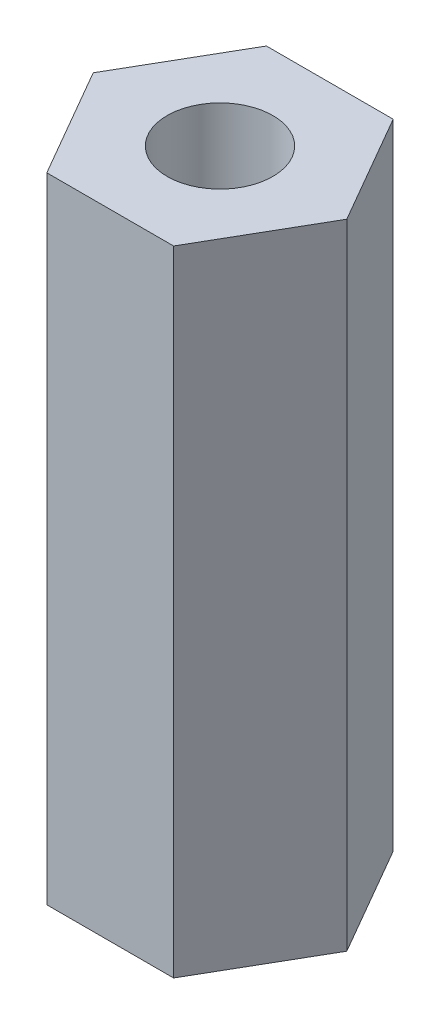
ISO-10303-21;
HEADER;
FILE_DESCRIPTION(('STEP AP214'),'2;1');
FILE_NAME('part.step','',(''),(''),'','','');
FILE_SCHEMA(('AUTOMOTIVE_DESIGN { 1 0 10303 214 1 1 1 1 }'));
ENDSEC;
DATA;
#1=APPLICATION_CONTEXT('core data for automotive mechanical design processes');
#2=APPLICATION_PROTOCOL_DEFINITION('international standard','automotive_design',2000,#1);
#3=PRODUCT_CONTEXT('',#1,'mechanical');
#4=PRODUCT('Part','Part','',(#3));
#5=PRODUCT_RELATED_PRODUCT_CATEGORY('part','',(#4));
#6=PRODUCT_DEFINITION_FORMATION('','',#4);
#7=PRODUCT_DEFINITION_CONTEXT('part definition',#1,'design');
#8=PRODUCT_DEFINITION('design','',#6,#7);
#9=PRODUCT_DEFINITION_SHAPE('','',#8);
#10=(LENGTH_UNIT() NAMED_UNIT(*) SI_UNIT(.MILLI.,.METRE.));
#11=(NAMED_UNIT(*) PLANE_ANGLE_UNIT() SI_UNIT($,.RADIAN.));
#12=(NAMED_UNIT(*) SI_UNIT($,.STERADIAN.) SOLID_ANGLE_UNIT());
#13=UNCERTAINTY_MEASURE_WITH_UNIT(LENGTH_MEASURE(1.E-05),#10,'distance_accuracy_value','');
#14=(GEOMETRIC_REPRESENTATION_CONTEXT(3) GLOBAL_UNCERTAINTY_ASSIGNED_CONTEXT((#13)) GLOBAL_UNIT_ASSIGNED_CONTEXT((#10,
#11,#12)) REPRESENTATION_CONTEXT('',''));
#15=CARTESIAN_POINT('',(0.,0.,0.));
#16=DIRECTION('',(0.,0.,1.));
#17=DIRECTION('',(1.,0.,0.));
#18=AXIS2_PLACEMENT_3D('',#15,#16,#17);
#19=CARTESIAN_POINT('',(3.,15.,0.));
#20=DIRECTION('',(-0.866025403784439,0.,0.5));
#21=DIRECTION('',(0.5,0.,0.866025403784439));
#22=AXIS2_PLACEMENT_3D('',#19,#20,#21);
#23=PLANE('',#22);
#24=DIRECTION('',(-0.5,0.,-0.866025403784439));
#25=VECTOR('',#24,1.);
#26=CARTESIAN_POINT('',(3.,0.,0.));
#27=LINE('',#26,#25);
#28=CARTESIAN_POINT('',(3.,0.,0.));
#29=VERTEX_POINT('',#28);
#30=CARTESIAN_POINT('',(1.5,0.,-2.59807621135332));
#31=VERTEX_POINT('',#30);
#32=EDGE_CURVE('E121',#29,#31,#27,.T.);
#33=ORIENTED_EDGE('',*,*,#32,.T.);
#34=DIRECTION('',(0.,-1.,0.));
#35=VECTOR('',#34,1.);
#36=CARTESIAN_POINT('',(1.5,15.,-2.59807621135332));
#37=LINE('',#36,#35);
#38=CARTESIAN_POINT('',(1.5,15.,-2.59807621135332));
#39=VERTEX_POINT('',#38);
#40=EDGE_CURVE('E11',#39,#31,#37,.T.);
#41=ORIENTED_EDGE('',*,*,#40,.F.);
#42=DIRECTION('',(-0.5,0.,-0.866025403784439));
#43=VECTOR('',#42,1.);
#44=CARTESIAN_POINT('',(3.,15.,0.));
#45=LINE('',#44,#43);
#46=CARTESIAN_POINT('',(3.,15.,0.));
#47=VERTEX_POINT('',#46);
#48=EDGE_CURVE('E132',#47,#39,#45,.T.);
#49=ORIENTED_EDGE('',*,*,#48,.F.);
#50=DIRECTION('',(0.,-1.,0.));
#51=VECTOR('',#50,1.);
#52=CARTESIAN_POINT('',(3.,15.,0.));
#53=LINE('',#52,#51);
#54=EDGE_CURVE('E117',#47,#29,#53,.T.);
#55=ORIENTED_EDGE('',*,*,#54,.T.);
#56=EDGE_LOOP('',(#33,#41,#49,#55));
#57=FACE_BOUND('',#56,.T.);
#58=ADVANCED_FACE('F37',(#57),#23,.F.);
#59=CARTESIAN_POINT('',(1.5,15.,-2.59807621135332));
#60=DIRECTION('',(0.,0.,1.));
#61=DIRECTION('',(1.,0.,0.));
#62=AXIS2_PLACEMENT_3D('',#59,#60,#61);
#63=PLANE('',#62);
#64=DIRECTION('',(-1.,0.,0.));
#65=VECTOR('',#64,1.);
#66=CARTESIAN_POINT('',(1.5,0.,-2.59807621135332));
#67=LINE('',#66,#65);
#68=CARTESIAN_POINT('',(-1.5,0.,-2.59807621135332));
#69=VERTEX_POINT('',#68);
#70=EDGE_CURVE('E124',#31,#69,#67,.T.);
#71=ORIENTED_EDGE('',*,*,#70,.T.);
#72=DIRECTION('',(0.,-1.,0.));
#73=VECTOR('',#72,1.);
#74=CARTESIAN_POINT('',(-1.5,15.,-2.59807621135332));
#75=LINE('',#74,#73);
#76=CARTESIAN_POINT('',(-1.5,15.,-2.59807621135332));
#77=VERTEX_POINT('',#76);
#78=EDGE_CURVE('E45',#77,#69,#75,.T.);
#79=ORIENTED_EDGE('',*,*,#78,.F.);
#80=DIRECTION('',(-1.,0.,0.));
#81=VECTOR('',#80,1.);
#82=CARTESIAN_POINT('',(1.5,15.,-2.59807621135332));
#83=LINE('',#82,#81);
#84=EDGE_CURVE('E90',#39,#77,#83,.T.);
#85=ORIENTED_EDGE('',*,*,#84,.F.);
#86=ORIENTED_EDGE('',*,*,#40,.T.);
#87=EDGE_LOOP('',(#71,#79,#85,#86));
#88=FACE_BOUND('',#87,.T.);
#89=ADVANCED_FACE('F157',(#88),#63,.F.);
#90=CARTESIAN_POINT('',(-1.5,15.,-2.59807621135332));
#91=DIRECTION('',(0.866025403784439,0.,0.5));
#92=DIRECTION('',(0.5,0.,-0.866025403784439));
#93=AXIS2_PLACEMENT_3D('',#90,#91,#92);
#94=PLANE('',#93);
#95=DIRECTION('',(-0.5,0.,0.866025403784439));
#96=VECTOR('',#95,1.);
#97=CARTESIAN_POINT('',(-1.5,0.,-2.59807621135332));
#98=LINE('',#97,#96);
#99=CARTESIAN_POINT('',(-3.,0.,0.));
#100=VERTEX_POINT('',#99);
#101=EDGE_CURVE('E127',#69,#100,#98,.T.);
#102=ORIENTED_EDGE('',*,*,#101,.T.);
#103=DIRECTION('',(0.,-1.,0.));
#104=VECTOR('',#103,1.);
#105=CARTESIAN_POINT('',(-3.,15.,0.));
#106=LINE('',#105,#104);
#107=CARTESIAN_POINT('',(-3.,15.,0.));
#108=VERTEX_POINT('',#107);
#109=EDGE_CURVE('E112',#108,#100,#106,.T.);
#110=ORIENTED_EDGE('',*,*,#109,.F.);
#111=DIRECTION('',(-0.5,0.,0.866025403784439));
#112=VECTOR('',#111,1.);
#113=CARTESIAN_POINT('',(-1.5,15.,-2.59807621135332));
#114=LINE('',#113,#112);
#115=EDGE_CURVE('E103',#77,#108,#114,.T.);
#116=ORIENTED_EDGE('',*,*,#115,.F.);
#117=ORIENTED_EDGE('',*,*,#78,.T.);
#118=EDGE_LOOP('',(#102,#110,#116,#117));
#119=FACE_BOUND('',#118,.T.);
#120=ADVANCED_FACE('F138',(#119),#94,.F.);
#121=CARTESIAN_POINT('',(-3.,15.,0.));
#122=DIRECTION('',(0.866025403784439,0.,-0.5));
#123=DIRECTION('',(-0.5,0.,-0.866025403784439));
#124=AXIS2_PLACEMENT_3D('',#121,#122,#123);
#125=PLANE('',#124);
#126=DIRECTION('',(0.5,0.,0.866025403784439));
#127=VECTOR('',#126,1.);
#128=CARTESIAN_POINT('',(-3.,0.,0.));
#129=LINE('',#128,#127);
#130=CARTESIAN_POINT('',(-1.5,0.,2.59807621135332));
#131=VERTEX_POINT('',#130);
#132=EDGE_CURVE('E111',#100,#131,#129,.T.);
#133=ORIENTED_EDGE('',*,*,#132,.T.);
#134=DIRECTION('',(0.,-1.,0.));
#135=VECTOR('',#134,1.);
#136=CARTESIAN_POINT('',(-1.5,15.,2.59807621135332));
#137=LINE('',#136,#135);
#138=CARTESIAN_POINT('',(-1.5,15.,2.59807621135332));
#139=VERTEX_POINT('',#138);
#140=EDGE_CURVE('E108',#139,#131,#137,.T.);
#141=ORIENTED_EDGE('',*,*,#140,.F.);
#142=DIRECTION('',(0.5,0.,0.866025403784439));
#143=VECTOR('',#142,1.);
#144=CARTESIAN_POINT('',(-3.,15.,0.));
#145=LINE('',#144,#143);
#146=EDGE_CURVE('E97',#108,#139,#145,.T.);
#147=ORIENTED_EDGE('',*,*,#146,.F.);
#148=ORIENTED_EDGE('',*,*,#109,.T.);
#149=EDGE_LOOP('',(#133,#141,#147,#148));
#150=FACE_BOUND('',#149,.T.);
#151=ADVANCED_FACE('F109',(#150),#125,.F.);
#152=CARTESIAN_POINT('',(-1.5,15.,2.59807621135332));
#153=DIRECTION('',(0.,0.,-1.));
#154=DIRECTION('',(-1.,0.,0.));
#155=AXIS2_PLACEMENT_3D('',#152,#153,#154);
#156=PLANE('',#155);
#157=DIRECTION('',(1.,0.,0.));
#158=VECTOR('',#157,1.);
#159=CARTESIAN_POINT('',(-1.5,0.,2.59807621135332));
#160=LINE('',#159,#158);
#161=CARTESIAN_POINT('',(1.5,0.,2.59807621135332));
#162=VERTEX_POINT('',#161);
#163=EDGE_CURVE('E76',#131,#162,#160,.T.);
#164=ORIENTED_EDGE('',*,*,#163,.T.);
#165=DIRECTION('',(0.,-1.,0.));
#166=VECTOR('',#165,1.);
#167=CARTESIAN_POINT('',(1.5,15.,2.59807621135332));
#168=LINE('',#167,#166);
#169=CARTESIAN_POINT('',(1.5,15.,2.59807621135332));
#170=VERTEX_POINT('',#169);
#171=EDGE_CURVE('E113',#170,#162,#168,.T.);
#172=ORIENTED_EDGE('',*,*,#171,.F.);
#173=DIRECTION('',(1.,0.,0.));
#174=VECTOR('',#173,1.);
#175=CARTESIAN_POINT('',(-1.5,15.,2.59807621135332));
#176=LINE('',#175,#174);
#177=EDGE_CURVE('E101',#139,#170,#176,.T.);
#178=ORIENTED_EDGE('',*,*,#177,.F.);
#179=ORIENTED_EDGE('',*,*,#140,.T.);
#180=EDGE_LOOP('',(#164,#172,#178,#179));
#181=FACE_BOUND('',#180,.T.);
#182=ADVANCED_FACE('F115',(#181),#156,.F.);
#183=CARTESIAN_POINT('',(1.5,15.,2.59807621135332));
#184=DIRECTION('',(-0.866025403784439,0.,-0.5));
#185=DIRECTION('',(-0.5,0.,0.866025403784439));
#186=AXIS2_PLACEMENT_3D('',#183,#184,#185);
#187=PLANE('',#186);
#188=DIRECTION('',(0.5,0.,-0.866025403784439));
#189=VECTOR('',#188,1.);
#190=CARTESIAN_POINT('',(1.5,0.,2.59807621135332));
#191=LINE('',#190,#189);
#192=EDGE_CURVE('E82',#162,#29,#191,.T.);
#193=ORIENTED_EDGE('',*,*,#192,.T.);
#194=ORIENTED_EDGE('',*,*,#54,.F.);
#195=DIRECTION('',(0.5,0.,-0.866025403784439));
#196=VECTOR('',#195,1.);
#197=CARTESIAN_POINT('',(1.5,15.,2.59807621135332));
#198=LINE('',#197,#196);
#199=EDGE_CURVE('E53',#170,#47,#198,.T.);
#200=ORIENTED_EDGE('',*,*,#199,.F.);
#201=ORIENTED_EDGE('',*,*,#171,.T.);
#202=EDGE_LOOP('',(#193,#194,#200,#201));
#203=FACE_BOUND('',#202,.T.);
#204=ADVANCED_FACE('F145',(#203),#187,.F.);
#205=CARTESIAN_POINT('',(0.,15.,0.));
#206=DIRECTION('',(0.,1.,0.));
#207=DIRECTION('',(0.,0.,1.));
#208=AXIS2_PLACEMENT_3D('',#205,#206,#207);
#209=PLANE('',#208);
#210=CARTESIAN_POINT('',(0.,15.,0.));
#211=DIRECTION('',(0.,1.,0.));
#212=DIRECTION('',(0.,0.,1.));
#213=AXIS2_PLACEMENT_3D('',#210,#211,#212);
#214=CIRCLE('',#213,1.25);
#215=CARTESIAN_POINT('',(0.,15.,1.25));
#216=VERTEX_POINT('',#215);
#217=EDGE_CURVE('E214',#216,#216,#214,.T.);
#218=ORIENTED_EDGE('',*,*,#217,.F.);
#219=EDGE_LOOP('',(#218));
#220=FACE_BOUND('',#219,.T.);
#221=ORIENTED_EDGE('',*,*,#48,.T.);
#222=ORIENTED_EDGE('',*,*,#84,.T.);
#223=ORIENTED_EDGE('',*,*,#115,.T.);
#224=ORIENTED_EDGE('',*,*,#146,.T.);
#225=ORIENTED_EDGE('',*,*,#177,.T.);
#226=ORIENTED_EDGE('',*,*,#199,.T.);
#227=EDGE_LOOP('',(#221,#222,#223,#224,#225,#226));
#228=FACE_BOUND('',#227,.T.);
#229=ADVANCED_FACE('F99',(#220,#228),#209,.T.);
#230=CARTESIAN_POINT('',(0.,0.,0.));
#231=DIRECTION('',(0.,1.,0.));
#232=DIRECTION('',(0.,0.,1.));
#233=AXIS2_PLACEMENT_3D('',#230,#231,#232);
#234=PLANE('',#233);
#235=CARTESIAN_POINT('',(0.,0.,0.));
#236=DIRECTION('',(0.,1.,0.));
#237=DIRECTION('',(0.,0.,1.));
#238=AXIS2_PLACEMENT_3D('',#235,#236,#237);
#239=CIRCLE('',#238,1.24999999999999);
#240=CARTESIAN_POINT('',(0.,0.,1.24999999999999));
#241=VERTEX_POINT('',#240);
#242=EDGE_CURVE('E125',#241,#241,#239,.T.);
#243=ORIENTED_EDGE('',*,*,#242,.T.);
#244=EDGE_LOOP('',(#243));
#245=FACE_BOUND('',#244,.T.);
#246=ORIENTED_EDGE('',*,*,#32,.F.);
#247=ORIENTED_EDGE('',*,*,#192,.F.);
#248=ORIENTED_EDGE('',*,*,#163,.F.);
#249=ORIENTED_EDGE('',*,*,#132,.F.);
#250=ORIENTED_EDGE('',*,*,#101,.F.);
#251=ORIENTED_EDGE('',*,*,#70,.F.);
#252=EDGE_LOOP('',(#246,#247,#248,#249,#250,#251));
#253=FACE_BOUND('',#252,.T.);
#254=ADVANCED_FACE('F141',(#245,#253),#234,.F.);
#255=CARTESIAN_POINT('',(0.,15.,0.));
#256=DIRECTION('',(0.,1.,0.));
#257=DIRECTION('',(0.,0.,1.));
#258=AXIS2_PLACEMENT_3D('',#255,#256,#257);
#259=CYLINDRICAL_SURFACE('',#258,1.25);
#260=ORIENTED_EDGE('',*,*,#242,.F.);
#261=EDGE_LOOP('',(#260));
#262=FACE_BOUND('',#261,.T.);
#263=ORIENTED_EDGE('',*,*,#217,.T.);
#264=EDGE_LOOP('',(#263));
#265=FACE_BOUND('',#264,.T.);
#266=ADVANCED_FACE('F194',(#262,#265),#259,.F.);
#267=CLOSED_SHELL('',(#58,#89,#120,#151,#182,#204,#229,#254,#266));
#268=MANIFOLD_SOLID_BREP('B2',#267);
#269=ADVANCED_BREP_SHAPE_REPRESENTATION('',(#18,#268),#14);
#270=SHAPE_DEFINITION_REPRESENTATION(#9,#269);
ENDSEC;
END-ISO-10303-21;
